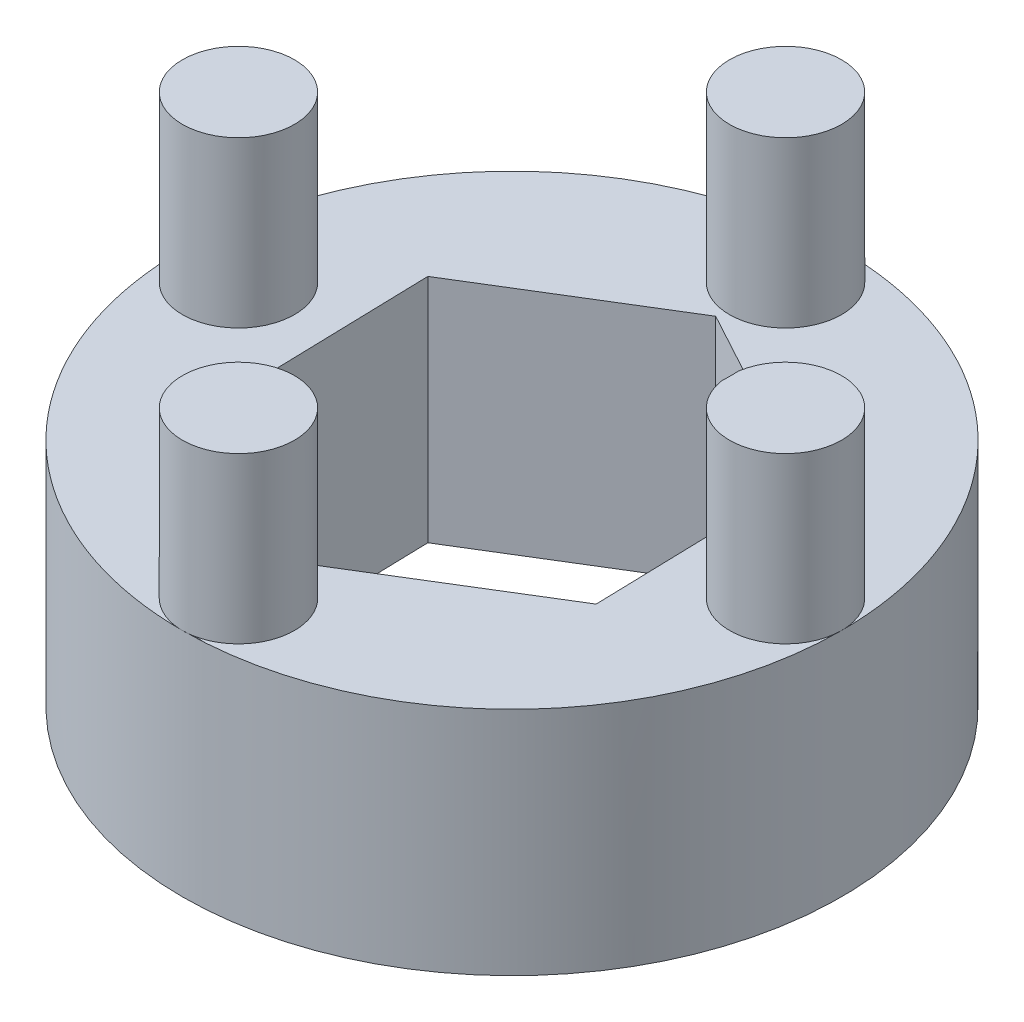
ISO-10303-21;
HEADER;
FILE_DESCRIPTION(('STEP AP214'),'2;1');
FILE_NAME('part.step','',(''),(''),'','','');
FILE_SCHEMA(('AUTOMOTIVE_DESIGN { 1 0 10303 214 1 1 1 1 }'));
ENDSEC;
DATA;
#1=APPLICATION_CONTEXT('core data for automotive mechanical design processes');
#2=APPLICATION_PROTOCOL_DEFINITION('international standard','automotive_design',2000,#1);
#3=PRODUCT_CONTEXT('',#1,'mechanical');
#4=PRODUCT('Part','Part','',(#3));
#5=PRODUCT_RELATED_PRODUCT_CATEGORY('part','',(#4));
#6=PRODUCT_DEFINITION_FORMATION('','',#4);
#7=PRODUCT_DEFINITION_CONTEXT('part definition',#1,'design');
#8=PRODUCT_DEFINITION('design','',#6,#7);
#9=PRODUCT_DEFINITION_SHAPE('','',#8);
#10=(LENGTH_UNIT() NAMED_UNIT(*) SI_UNIT(.MILLI.,.METRE.));
#11=(NAMED_UNIT(*) PLANE_ANGLE_UNIT() SI_UNIT($,.RADIAN.));
#12=(NAMED_UNIT(*) SI_UNIT($,.STERADIAN.) SOLID_ANGLE_UNIT());
#13=UNCERTAINTY_MEASURE_WITH_UNIT(LENGTH_MEASURE(1.E-05),#10,'distance_accuracy_value','');
#14=(GEOMETRIC_REPRESENTATION_CONTEXT(3) GLOBAL_UNCERTAINTY_ASSIGNED_CONTEXT((#13)) GLOBAL_UNIT_ASSIGNED_CONTEXT((#10,
#11,#12)) REPRESENTATION_CONTEXT('',''));
#15=CARTESIAN_POINT('',(0.,0.,0.));
#16=DIRECTION('',(0.,0.,1.));
#17=DIRECTION('',(1.,0.,0.));
#18=AXIS2_PLACEMENT_3D('',#15,#16,#17);
#19=CARTESIAN_POINT('',(0.,7.,0.));
#20=DIRECTION('',(0.,-1.,0.));
#21=DIRECTION('',(0.,0.,-1.));
#22=AXIS2_PLACEMENT_3D('',#19,#20,#21);
#23=CYLINDRICAL_SURFACE('',#22,10.);
#24=CARTESIAN_POINT('',(0.,7.,0.));
#25=DIRECTION('',(0.,1.,0.));
#26=DIRECTION('',(0.,0.,1.));
#27=AXIS2_PLACEMENT_3D('',#24,#25,#26);
#28=CIRCLE('',#27,10.);
#29=CARTESIAN_POINT('',(0.,7.,-10.));
#30=VERTEX_POINT('',#29);
#31=CARTESIAN_POINT('',(-10.,7.,0.));
#32=VERTEX_POINT('',#31);
#33=EDGE_CURVE('E47',#30,#32,#28,.T.);
#34=ORIENTED_EDGE('',*,*,#33,.F.);
#35=CARTESIAN_POINT('',(10.,7.,0.));
#36=VERTEX_POINT('',#35);
#37=EDGE_CURVE('E202',#36,#30,#28,.T.);
#38=ORIENTED_EDGE('',*,*,#37,.F.);
#39=CARTESIAN_POINT('',(0.,7.,10.));
#40=VERTEX_POINT('',#39);
#41=EDGE_CURVE('E206',#40,#36,#28,.T.);
#42=ORIENTED_EDGE('',*,*,#41,.F.);
#43=EDGE_CURVE('E201',#32,#40,#28,.T.);
#44=ORIENTED_EDGE('',*,*,#43,.F.);
#45=EDGE_LOOP('',(#34,#38,#42,#44));
#46=FACE_BOUND('',#45,.T.);
#47=CARTESIAN_POINT('',(0.,0.,0.));
#48=DIRECTION('',(0.,1.,0.));
#49=DIRECTION('',(0.,0.,1.));
#50=AXIS2_PLACEMENT_3D('',#47,#48,#49);
#51=CIRCLE('',#50,10.);
#52=CARTESIAN_POINT('',(0.,0.,10.));
#53=VERTEX_POINT('',#52);
#54=EDGE_CURVE('E197',#53,#53,#51,.T.);
#55=ORIENTED_EDGE('',*,*,#54,.T.);
#56=EDGE_LOOP('',(#55));
#57=FACE_BOUND('',#56,.T.);
#58=ADVANCED_FACE('F40',(#46,#57),#23,.T.);
#59=CARTESIAN_POINT('',(0.,7.,0.));
#60=DIRECTION('',(0.,1.,0.));
#61=DIRECTION('',(0.,0.,1.));
#62=AXIS2_PLACEMENT_3D('',#59,#60,#61);
#63=PLANE('',#62);
#64=DIRECTION('',(-0.852514994339733,0.,0.522702768718442));
#65=VECTOR('',#64,1.);
#66=CARTESIAN_POINT('',(-0.167766539865125,7.,-6.34863668211019));
#67=LINE('',#66,#65);
#68=CARTESIAN_POINT('',(-0.167766539865125,7.,-6.34863668211019));
#69=VERTEX_POINT('',#68);
#70=CARTESIAN_POINT('',(-5.58196391603773,7.,-3.02902825562688));
#71=VERTEX_POINT('',#70);
#72=EDGE_CURVE('E54',#69,#71,#67,.T.);
#73=ORIENTED_EDGE('',*,*,#72,.F.);
#74=DIRECTION('',(-0.878931373508499,0.,-0.476948257846135));
#75=VECTOR('',#74,1.);
#76=CARTESIAN_POINT('',(5.41419737617261,7.,-3.31960842648331));
#77=LINE('',#76,#75);
#78=CARTESIAN_POINT('',(5.41419737617261,7.,-3.31960842648331));
#79=VERTEX_POINT('',#78);
#80=EDGE_CURVE('E134',#79,#69,#77,.T.);
#81=ORIENTED_EDGE('',*,*,#80,.F.);
#82=DIRECTION('',(-0.0264163791687661,0.,-0.999651026564577));
#83=VECTOR('',#82,1.);
#84=CARTESIAN_POINT('',(5.58196391603773,7.,3.02902825562688));
#85=LINE('',#84,#83);
#86=CARTESIAN_POINT('',(5.58196391603773,7.,3.02902825562688));
#87=VERTEX_POINT('',#86);
#88=EDGE_CURVE('E137',#87,#79,#85,.T.);
#89=ORIENTED_EDGE('',*,*,#88,.F.);
#90=DIRECTION('',(0.852514994339733,0.,-0.522702768718442));
#91=VECTOR('',#90,1.);
#92=CARTESIAN_POINT('',(0.167766539865124,7.,6.34863668211019));
#93=LINE('',#92,#91);
#94=CARTESIAN_POINT('',(0.167766539865124,7.,6.34863668211019));
#95=VERTEX_POINT('',#94);
#96=EDGE_CURVE('E153',#95,#87,#93,.T.);
#97=ORIENTED_EDGE('',*,*,#96,.F.);
#98=DIRECTION('',(0.878931373508499,0.,0.476948257846135));
#99=VECTOR('',#98,1.);
#100=CARTESIAN_POINT('',(-5.41419737617261,7.,3.31960842648331));
#101=LINE('',#100,#99);
#102=CARTESIAN_POINT('',(-5.41419737617261,7.,3.31960842648331));
#103=VERTEX_POINT('',#102);
#104=EDGE_CURVE('E150',#103,#95,#101,.T.);
#105=ORIENTED_EDGE('',*,*,#104,.F.);
#106=DIRECTION('',(0.0264163791687661,0.,0.999651026564577));
#107=VECTOR('',#106,1.);
#108=CARTESIAN_POINT('',(-5.58196391603773,7.,-3.02902825562688));
#109=LINE('',#108,#107);
#110=EDGE_CURVE('E148',#71,#103,#109,.T.);
#111=ORIENTED_EDGE('',*,*,#110,.F.);
#112=EDGE_LOOP('',(#73,#81,#89,#97,#105,#111));
#113=FACE_BOUND('',#112,.T.);
#114=CARTESIAN_POINT('',(0.,7.,0.));
#115=DIRECTION('',(0.,1.,0.));
#116=DIRECTION('',(0.,0.,1.));
#117=AXIS2_PLACEMENT_3D('',#114,#115,#116);
#118=CIRCLE('',#117,6.62385042933958);
#119=CARTESIAN_POINT('',(6.6189996692929,7.,0.253451944483816));
#120=VERTEX_POINT('',#119);
#121=CARTESIAN_POINT('',(6.6189996692929,7.,-0.253451944483813));
#122=VERTEX_POINT('',#121);
#123=EDGE_CURVE('E171',#120,#122,#118,.T.);
#124=ORIENTED_EDGE('',*,*,#123,.T.);
#125=CARTESIAN_POINT('',(8.3,7.,0.));
#126=DIRECTION('',(0.,1.,0.));
#127=DIRECTION('',(0.,0.,1.));
#128=AXIS2_PLACEMENT_3D('',#125,#126,#127);
#129=CIRCLE('',#128,1.7);
#130=EDGE_CURVE('E11',#122,#36,#129,.F.);
#131=ORIENTED_EDGE('',*,*,#130,.T.);
#132=ORIENTED_EDGE('',*,*,#37,.T.);
#133=CARTESIAN_POINT('',(0.,7.,-8.3));
#134=DIRECTION('',(0.,1.,0.));
#135=DIRECTION('',(0.,0.,1.));
#136=AXIS2_PLACEMENT_3D('',#133,#134,#135);
#137=CIRCLE('',#136,1.7);
#138=EDGE_CURVE('E192',#30,#30,#137,.T.);
#139=ORIENTED_EDGE('',*,*,#138,.F.);
#140=ORIENTED_EDGE('',*,*,#33,.T.);
#141=CARTESIAN_POINT('',(-8.3,7.,0.));
#142=DIRECTION('',(0.,1.,0.));
#143=DIRECTION('',(0.,0.,1.));
#144=AXIS2_PLACEMENT_3D('',#141,#142,#143);
#145=CIRCLE('',#144,1.7);
#146=EDGE_CURVE('E187',#32,#32,#145,.T.);
#147=ORIENTED_EDGE('',*,*,#146,.F.);
#148=ORIENTED_EDGE('',*,*,#43,.T.);
#149=CARTESIAN_POINT('',(0.,7.,8.3));
#150=DIRECTION('',(0.,1.,0.));
#151=DIRECTION('',(0.,0.,1.));
#152=AXIS2_PLACEMENT_3D('',#149,#150,#151);
#153=CIRCLE('',#152,1.7);
#154=EDGE_CURVE('E183',#40,#40,#153,.T.);
#155=ORIENTED_EDGE('',*,*,#154,.F.);
#156=ORIENTED_EDGE('',*,*,#41,.T.);
#157=CARTESIAN_POINT('',(8.3,7.,0.));
#158=DIRECTION('',(0.,1.,0.));
#159=DIRECTION('',(0.,0.,1.));
#160=AXIS2_PLACEMENT_3D('',#157,#158,#159);
#161=CIRCLE('',#160,1.7);
#162=EDGE_CURVE('E160',#120,#36,#161,.T.);
#163=ORIENTED_EDGE('',*,*,#162,.F.);
#164=EDGE_LOOP('',(#124,#131,#132,#139,#140,#147,#148,#155,#156,#163));
#165=FACE_BOUND('',#164,.T.);
#166=ADVANCED_FACE('F217',(#113,#165),#63,.T.);
#167=CARTESIAN_POINT('',(0.,0.,0.));
#168=DIRECTION('',(0.,1.,0.));
#169=DIRECTION('',(0.,0.,1.));
#170=AXIS2_PLACEMENT_3D('',#167,#168,#169);
#171=PLANE('',#170);
#172=DIRECTION('',(-0.878931373508499,0.,-0.476948257846135));
#173=VECTOR('',#172,1.);
#174=CARTESIAN_POINT('',(5.41419737617261,0.,-3.31960842648331));
#175=LINE('',#174,#173);
#176=CARTESIAN_POINT('',(5.41419737617261,0.,-3.31960842648331));
#177=VERTEX_POINT('',#176);
#178=CARTESIAN_POINT('',(-0.167766539865125,0.,-6.34863668211019));
#179=VERTEX_POINT('',#178);
#180=EDGE_CURVE('E123',#177,#179,#175,.T.);
#181=ORIENTED_EDGE('',*,*,#180,.T.);
#182=DIRECTION('',(-0.852514994339733,0.,0.522702768718442));
#183=VECTOR('',#182,1.);
#184=CARTESIAN_POINT('',(-0.167766539865125,0.,-6.34863668211019));
#185=LINE('',#184,#183);
#186=CARTESIAN_POINT('',(-5.58196391603773,0.,-3.02902825562688));
#187=VERTEX_POINT('',#186);
#188=EDGE_CURVE('E117',#179,#187,#185,.T.);
#189=ORIENTED_EDGE('',*,*,#188,.T.);
#190=DIRECTION('',(0.0264163791687661,0.,0.999651026564577));
#191=VECTOR('',#190,1.);
#192=CARTESIAN_POINT('',(-5.58196391603773,0.,-3.02902825562688));
#193=LINE('',#192,#191);
#194=CARTESIAN_POINT('',(-5.41419737617261,0.,3.31960842648331));
#195=VERTEX_POINT('',#194);
#196=EDGE_CURVE('E126',#187,#195,#193,.T.);
#197=ORIENTED_EDGE('',*,*,#196,.T.);
#198=DIRECTION('',(0.878931373508499,0.,0.476948257846135));
#199=VECTOR('',#198,1.);
#200=CARTESIAN_POINT('',(-5.41419737617261,0.,3.31960842648331));
#201=LINE('',#200,#199);
#202=CARTESIAN_POINT('',(0.167766539865124,0.,6.34863668211019));
#203=VERTEX_POINT('',#202);
#204=EDGE_CURVE('E62',#195,#203,#201,.T.);
#205=ORIENTED_EDGE('',*,*,#204,.T.);
#206=DIRECTION('',(0.852514994339733,0.,-0.522702768718442));
#207=VECTOR('',#206,1.);
#208=CARTESIAN_POINT('',(0.167766539865124,0.,6.34863668211019));
#209=LINE('',#208,#207);
#210=CARTESIAN_POINT('',(5.58196391603773,0.,3.02902825562688));
#211=VERTEX_POINT('',#210);
#212=EDGE_CURVE('E141',#203,#211,#209,.T.);
#213=ORIENTED_EDGE('',*,*,#212,.T.);
#214=DIRECTION('',(-0.0264163791687661,0.,-0.999651026564577));
#215=VECTOR('',#214,1.);
#216=CARTESIAN_POINT('',(5.58196391603773,0.,3.02902825562688));
#217=LINE('',#216,#215);
#218=EDGE_CURVE('E144',#211,#177,#217,.T.);
#219=ORIENTED_EDGE('',*,*,#218,.T.);
#220=EDGE_LOOP('',(#181,#189,#197,#205,#213,#219));
#221=FACE_BOUND('',#220,.T.);
#222=ORIENTED_EDGE('',*,*,#54,.F.);
#223=EDGE_LOOP('',(#222));
#224=FACE_BOUND('',#223,.T.);
#225=ADVANCED_FACE('F130',(#221,#224),#171,.F.);
#226=CARTESIAN_POINT('',(0.,12.,-8.3));
#227=DIRECTION('',(0.,-1.,0.));
#228=DIRECTION('',(0.,0.,-1.));
#229=AXIS2_PLACEMENT_3D('',#226,#227,#228);
#230=CYLINDRICAL_SURFACE('',#229,1.7);
#231=CARTESIAN_POINT('',(0.,12.,-8.3));
#232=DIRECTION('',(0.,1.,0.));
#233=DIRECTION('',(0.,0.,1.));
#234=AXIS2_PLACEMENT_3D('',#231,#232,#233);
#235=CIRCLE('',#234,1.7);
#236=CARTESIAN_POINT('',(0.,12.,-6.6));
#237=VERTEX_POINT('',#236);
#238=EDGE_CURVE('E194',#237,#237,#235,.T.);
#239=ORIENTED_EDGE('',*,*,#238,.F.);
#240=EDGE_LOOP('',(#239));
#241=FACE_BOUND('',#240,.T.);
#242=ORIENTED_EDGE('',*,*,#138,.T.);
#243=EDGE_LOOP('',(#242));
#244=FACE_BOUND('',#243,.T.);
#245=ADVANCED_FACE('F220',(#241,#244),#230,.T.);
#246=CARTESIAN_POINT('',(0.,12.,0.));
#247=DIRECTION('',(0.,1.,0.));
#248=DIRECTION('',(0.,0.,1.));
#249=AXIS2_PLACEMENT_3D('',#246,#247,#248);
#250=PLANE('',#249);
#251=ORIENTED_EDGE('',*,*,#238,.T.);
#252=EDGE_LOOP('',(#251));
#253=FACE_BOUND('',#252,.T.);
#254=ADVANCED_FACE('F222',(#253),#250,.T.);
#255=CARTESIAN_POINT('',(-8.3,12.,0.));
#256=DIRECTION('',(0.,-1.,0.));
#257=DIRECTION('',(0.,0.,-1.));
#258=AXIS2_PLACEMENT_3D('',#255,#256,#257);
#259=CYLINDRICAL_SURFACE('',#258,1.7);
#260=CARTESIAN_POINT('',(-8.3,12.,0.));
#261=DIRECTION('',(0.,1.,0.));
#262=DIRECTION('',(0.,0.,1.));
#263=AXIS2_PLACEMENT_3D('',#260,#261,#262);
#264=CIRCLE('',#263,1.7);
#265=CARTESIAN_POINT('',(-8.3,12.,1.7));
#266=VERTEX_POINT('',#265);
#267=EDGE_CURVE('E189',#266,#266,#264,.T.);
#268=ORIENTED_EDGE('',*,*,#267,.F.);
#269=EDGE_LOOP('',(#268));
#270=FACE_BOUND('',#269,.T.);
#271=ORIENTED_EDGE('',*,*,#146,.T.);
#272=EDGE_LOOP('',(#271));
#273=FACE_BOUND('',#272,.T.);
#274=ADVANCED_FACE('F229',(#270,#273),#259,.T.);
#275=CARTESIAN_POINT('',(0.,12.,0.));
#276=DIRECTION('',(0.,1.,0.));
#277=DIRECTION('',(0.,0.,1.));
#278=AXIS2_PLACEMENT_3D('',#275,#276,#277);
#279=PLANE('',#278);
#280=ORIENTED_EDGE('',*,*,#267,.T.);
#281=EDGE_LOOP('',(#280));
#282=FACE_BOUND('',#281,.T.);
#283=ADVANCED_FACE('F288',(#282),#279,.T.);
#284=CARTESIAN_POINT('',(0.,12.,8.3));
#285=DIRECTION('',(0.,-1.,0.));
#286=DIRECTION('',(0.,0.,-1.));
#287=AXIS2_PLACEMENT_3D('',#284,#285,#286);
#288=CYLINDRICAL_SURFACE('',#287,1.7);
#289=CARTESIAN_POINT('',(0.,12.,8.3));
#290=DIRECTION('',(0.,1.,0.));
#291=DIRECTION('',(0.,0.,1.));
#292=AXIS2_PLACEMENT_3D('',#289,#290,#291);
#293=CIRCLE('',#292,1.7);
#294=CARTESIAN_POINT('',(0.,12.,10.));
#295=VERTEX_POINT('',#294);
#296=EDGE_CURVE('E184',#295,#295,#293,.T.);
#297=ORIENTED_EDGE('',*,*,#296,.F.);
#298=EDGE_LOOP('',(#297));
#299=FACE_BOUND('',#298,.T.);
#300=ORIENTED_EDGE('',*,*,#154,.T.);
#301=EDGE_LOOP('',(#300));
#302=FACE_BOUND('',#301,.T.);
#303=ADVANCED_FACE('F284',(#299,#302),#288,.T.);
#304=CARTESIAN_POINT('',(0.,12.,0.));
#305=DIRECTION('',(0.,1.,0.));
#306=DIRECTION('',(0.,0.,1.));
#307=AXIS2_PLACEMENT_3D('',#304,#305,#306);
#308=PLANE('',#307);
#309=ORIENTED_EDGE('',*,*,#296,.T.);
#310=EDGE_LOOP('',(#309));
#311=FACE_BOUND('',#310,.T.);
#312=ADVANCED_FACE('F280',(#311),#308,.T.);
#313=CARTESIAN_POINT('',(8.3,12.,0.));
#314=DIRECTION('',(0.,-1.,0.));
#315=DIRECTION('',(0.,0.,-1.));
#316=AXIS2_PLACEMENT_3D('',#313,#314,#315);
#317=CYLINDRICAL_SURFACE('',#316,1.7);
#318=ORIENTED_EDGE('',*,*,#162,.T.);
#319=ORIENTED_EDGE('',*,*,#130,.F.);
#320=DIRECTION('',(0.,-1.,0.));
#321=VECTOR('',#320,1.);
#322=CARTESIAN_POINT('',(6.6189996692929,12.,-0.253451944483813));
#323=LINE('',#322,#321);
#324=CARTESIAN_POINT('',(6.6189996692929,12.,-0.253451944483813));
#325=VERTEX_POINT('',#324);
#326=EDGE_CURVE('E180',#325,#122,#323,.T.);
#327=ORIENTED_EDGE('',*,*,#326,.F.);
#328=CARTESIAN_POINT('',(8.3,12.,0.));
#329=DIRECTION('',(0.,1.,0.));
#330=DIRECTION('',(0.,0.,1.));
#331=AXIS2_PLACEMENT_3D('',#328,#329,#330);
#332=CIRCLE('',#331,1.7);
#333=CARTESIAN_POINT('',(6.6189996692929,12.,0.253451944483816));
#334=VERTEX_POINT('',#333);
#335=EDGE_CURVE('E168',#334,#325,#332,.T.);
#336=ORIENTED_EDGE('',*,*,#335,.F.);
#337=DIRECTION('',(0.,-1.,0.));
#338=VECTOR('',#337,1.);
#339=CARTESIAN_POINT('',(6.6189996692929,12.,0.253451944483816));
#340=LINE('',#339,#338);
#341=EDGE_CURVE('E174',#334,#120,#340,.T.);
#342=ORIENTED_EDGE('',*,*,#341,.T.);
#343=EDGE_LOOP('',(#318,#319,#327,#336,#342));
#344=FACE_BOUND('',#343,.T.);
#345=ADVANCED_FACE('F276',(#344),#317,.T.);
#346=CARTESIAN_POINT('',(0.,12.,0.));
#347=DIRECTION('',(0.,-1.,0.));
#348=DIRECTION('',(0.,0.,-1.));
#349=AXIS2_PLACEMENT_3D('',#346,#347,#348);
#350=CYLINDRICAL_SURFACE('',#349,6.62385042933958);
#351=ORIENTED_EDGE('',*,*,#123,.F.);
#352=ORIENTED_EDGE('',*,*,#341,.F.);
#353=CARTESIAN_POINT('',(0.,12.,0.));
#354=DIRECTION('',(0.,1.,0.));
#355=DIRECTION('',(0.,0.,1.));
#356=AXIS2_PLACEMENT_3D('',#353,#354,#355);
#357=CIRCLE('',#356,6.62385042933958);
#358=EDGE_CURVE('E170',#334,#325,#357,.T.);
#359=ORIENTED_EDGE('',*,*,#358,.T.);
#360=ORIENTED_EDGE('',*,*,#326,.T.);
#361=EDGE_LOOP('',(#351,#352,#359,#360));
#362=FACE_BOUND('',#361,.T.);
#363=ADVANCED_FACE('F272',(#362),#350,.F.);
#364=CARTESIAN_POINT('',(0.,12.,0.));
#365=DIRECTION('',(0.,1.,0.));
#366=DIRECTION('',(0.,0.,1.));
#367=AXIS2_PLACEMENT_3D('',#364,#365,#366);
#368=PLANE('',#367);
#369=ORIENTED_EDGE('',*,*,#335,.T.);
#370=ORIENTED_EDGE('',*,*,#358,.F.);
#371=EDGE_LOOP('',(#369,#370));
#372=FACE_BOUND('',#371,.T.);
#373=ADVANCED_FACE('F261',(#372),#368,.T.);
#374=CARTESIAN_POINT('',(-0.167766539865125,0.,-6.34863668211019));
#375=DIRECTION('',(-0.522702768718442,0.,-0.852514994339733));
#376=DIRECTION('',(-0.852514994339733,0.,0.522702768718442));
#377=AXIS2_PLACEMENT_3D('',#374,#375,#376);
#378=PLANE('',#377);
#379=ORIENTED_EDGE('',*,*,#72,.T.);
#380=DIRECTION('',(0.,1.,0.));
#381=VECTOR('',#380,1.);
#382=CARTESIAN_POINT('',(-5.58196391603773,0.,-3.02902825562688));
#383=LINE('',#382,#381);
#384=EDGE_CURVE('E113',#187,#71,#383,.T.);
#385=ORIENTED_EDGE('',*,*,#384,.F.);
#386=ORIENTED_EDGE('',*,*,#188,.F.);
#387=DIRECTION('',(0.,1.,0.));
#388=VECTOR('',#387,1.);
#389=CARTESIAN_POINT('',(-0.167766539865125,0.,-6.34863668211019));
#390=LINE('',#389,#388);
#391=EDGE_CURVE('E158',#179,#69,#390,.T.);
#392=ORIENTED_EDGE('',*,*,#391,.T.);
#393=EDGE_LOOP('',(#379,#385,#386,#392));
#394=FACE_BOUND('',#393,.T.);
#395=ADVANCED_FACE('F115',(#394),#378,.F.);
#396=CARTESIAN_POINT('',(5.41419737617261,0.,-3.31960842648331));
#397=DIRECTION('',(0.476948257846135,0.,-0.878931373508499));
#398=DIRECTION('',(-0.878931373508499,0.,-0.476948257846135));
#399=AXIS2_PLACEMENT_3D('',#396,#397,#398);
#400=PLANE('',#399);
#401=ORIENTED_EDGE('',*,*,#80,.T.);
#402=ORIENTED_EDGE('',*,*,#391,.F.);
#403=ORIENTED_EDGE('',*,*,#180,.F.);
#404=DIRECTION('',(0.,1.,0.));
#405=VECTOR('',#404,1.);
#406=CARTESIAN_POINT('',(5.41419737617261,0.,-3.31960842648331));
#407=LINE('',#406,#405);
#408=EDGE_CURVE('E161',#177,#79,#407,.T.);
#409=ORIENTED_EDGE('',*,*,#408,.T.);
#410=EDGE_LOOP('',(#401,#402,#403,#409));
#411=FACE_BOUND('',#410,.T.);
#412=ADVANCED_FACE('F253',(#411),#400,.F.);
#413=CARTESIAN_POINT('',(5.58196391603773,0.,3.02902825562688));
#414=DIRECTION('',(0.999651026564577,0.,-0.0264163791687661));
#415=DIRECTION('',(-0.0264163791687661,0.,-0.999651026564577));
#416=AXIS2_PLACEMENT_3D('',#413,#414,#415);
#417=PLANE('',#416);
#418=ORIENTED_EDGE('',*,*,#88,.T.);
#419=ORIENTED_EDGE('',*,*,#408,.F.);
#420=ORIENTED_EDGE('',*,*,#218,.F.);
#421=DIRECTION('',(0.,1.,0.));
#422=VECTOR('',#421,1.);
#423=CARTESIAN_POINT('',(5.58196391603773,0.,3.02902825562688));
#424=LINE('',#423,#422);
#425=EDGE_CURVE('E163',#211,#87,#424,.T.);
#426=ORIENTED_EDGE('',*,*,#425,.T.);
#427=EDGE_LOOP('',(#418,#419,#420,#426));
#428=FACE_BOUND('',#427,.T.);
#429=ADVANCED_FACE('F251',(#428),#417,.F.);
#430=CARTESIAN_POINT('',(0.167766539865124,0.,6.34863668211019));
#431=DIRECTION('',(0.522702768718442,0.,0.852514994339733));
#432=DIRECTION('',(0.852514994339733,0.,-0.522702768718442));
#433=AXIS2_PLACEMENT_3D('',#430,#431,#432);
#434=PLANE('',#433);
#435=ORIENTED_EDGE('',*,*,#96,.T.);
#436=ORIENTED_EDGE('',*,*,#425,.F.);
#437=ORIENTED_EDGE('',*,*,#212,.F.);
#438=DIRECTION('',(0.,1.,0.));
#439=VECTOR('',#438,1.);
#440=CARTESIAN_POINT('',(0.167766539865124,0.,6.34863668211019));
#441=LINE('',#440,#439);
#442=EDGE_CURVE('E165',#203,#95,#441,.T.);
#443=ORIENTED_EDGE('',*,*,#442,.T.);
#444=EDGE_LOOP('',(#435,#436,#437,#443));
#445=FACE_BOUND('',#444,.T.);
#446=ADVANCED_FACE('F248',(#445),#434,.F.);
#447=CARTESIAN_POINT('',(-5.41419737617261,0.,3.31960842648331));
#448=DIRECTION('',(-0.476948257846135,0.,0.878931373508499));
#449=DIRECTION('',(0.878931373508499,0.,0.476948257846135));
#450=AXIS2_PLACEMENT_3D('',#447,#448,#449);
#451=PLANE('',#450);
#452=ORIENTED_EDGE('',*,*,#104,.T.);
#453=ORIENTED_EDGE('',*,*,#442,.F.);
#454=ORIENTED_EDGE('',*,*,#204,.F.);
#455=DIRECTION('',(0.,1.,0.));
#456=VECTOR('',#455,1.);
#457=CARTESIAN_POINT('',(-5.41419737617261,0.,3.31960842648331));
#458=LINE('',#457,#456);
#459=EDGE_CURVE('E122',#195,#103,#458,.T.);
#460=ORIENTED_EDGE('',*,*,#459,.T.);
#461=EDGE_LOOP('',(#452,#453,#454,#460));
#462=FACE_BOUND('',#461,.T.);
#463=ADVANCED_FACE('F245',(#462),#451,.F.);
#464=CARTESIAN_POINT('',(-5.58196391603773,0.,-3.02902825562688));
#465=DIRECTION('',(-0.999651026564577,0.,0.0264163791687661));
#466=DIRECTION('',(0.0264163791687661,0.,0.999651026564577));
#467=AXIS2_PLACEMENT_3D('',#464,#465,#466);
#468=PLANE('',#467);
#469=ORIENTED_EDGE('',*,*,#110,.T.);
#470=ORIENTED_EDGE('',*,*,#459,.F.);
#471=ORIENTED_EDGE('',*,*,#196,.F.);
#472=ORIENTED_EDGE('',*,*,#384,.T.);
#473=EDGE_LOOP('',(#469,#470,#471,#472));
#474=FACE_BOUND('',#473,.T.);
#475=ADVANCED_FACE('F127',(#474),#468,.F.);
#476=CLOSED_SHELL('',(#58,#166,#225,#245,#254,#274,#283,#303,#312,#345,#363,#373,#395,#412,#429,
#446,#463,#475));
#477=MANIFOLD_SOLID_BREP('B2',#476);
#478=ADVANCED_BREP_SHAPE_REPRESENTATION('',(#18,#477),#14);
#479=SHAPE_DEFINITION_REPRESENTATION(#9,#478);
ENDSEC;
END-ISO-10303-21;
